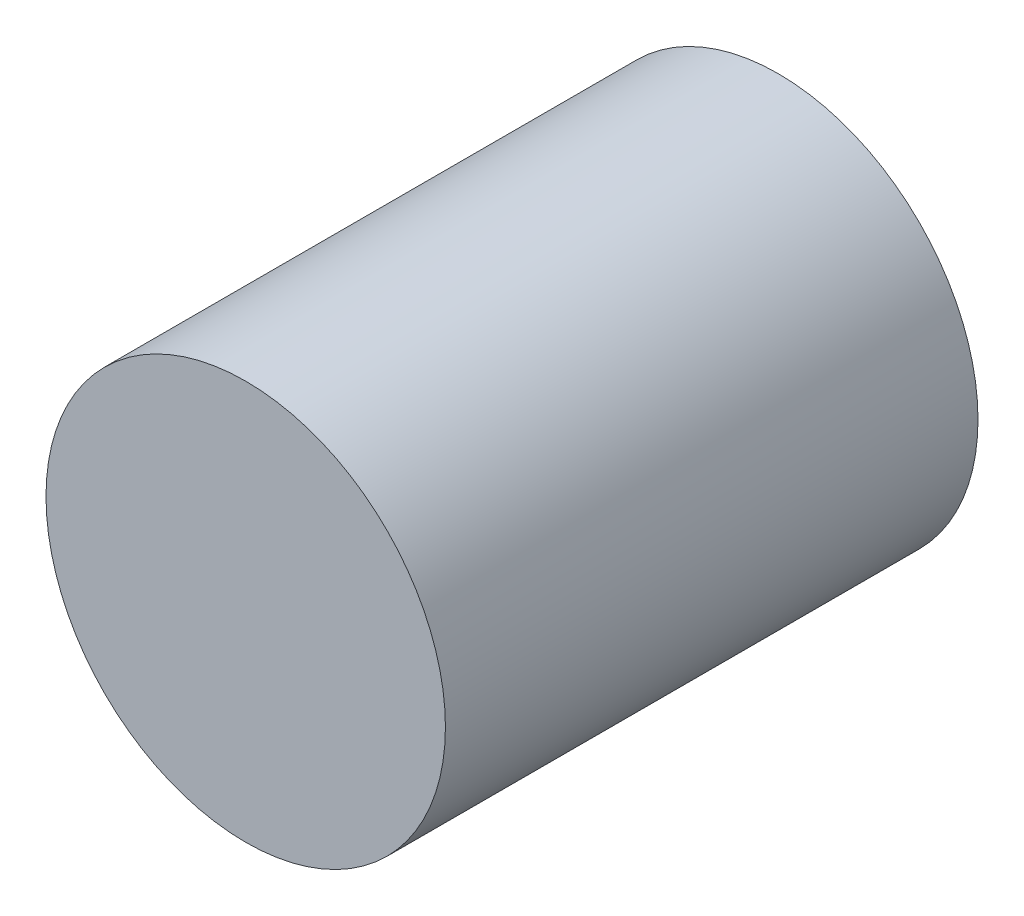
ISO-10303-21;
HEADER;
FILE_DESCRIPTION(('STEP AP214'),'2;1');
FILE_NAME('part.step','',(''),(''),'','','');
FILE_SCHEMA(('AUTOMOTIVE_DESIGN { 1 0 10303 214 1 1 1 1 }'));
ENDSEC;
DATA;
#1=APPLICATION_CONTEXT('core data for automotive mechanical design processes');
#2=APPLICATION_PROTOCOL_DEFINITION('international standard','automotive_design',2000,#1);
#3=PRODUCT_CONTEXT('',#1,'mechanical');
#4=PRODUCT('Part','Part','',(#3));
#5=PRODUCT_RELATED_PRODUCT_CATEGORY('part','',(#4));
#6=PRODUCT_DEFINITION_FORMATION('','',#4);
#7=PRODUCT_DEFINITION_CONTEXT('part definition',#1,'design');
#8=PRODUCT_DEFINITION('design','',#6,#7);
#9=PRODUCT_DEFINITION_SHAPE('','',#8);
#10=(LENGTH_UNIT() NAMED_UNIT(*) SI_UNIT(.MILLI.,.METRE.));
#11=(NAMED_UNIT(*) PLANE_ANGLE_UNIT() SI_UNIT($,.RADIAN.));
#12=(NAMED_UNIT(*) SI_UNIT($,.STERADIAN.) SOLID_ANGLE_UNIT());
#13=UNCERTAINTY_MEASURE_WITH_UNIT(LENGTH_MEASURE(1.E-05),#10,'distance_accuracy_value','');
#14=(GEOMETRIC_REPRESENTATION_CONTEXT(3) GLOBAL_UNCERTAINTY_ASSIGNED_CONTEXT((#13)) GLOBAL_UNIT_ASSIGNED_CONTEXT((#10,
#11,#12)) REPRESENTATION_CONTEXT('',''));
#15=CARTESIAN_POINT('',(0.,0.,0.));
#16=DIRECTION('',(0.,0.,1.));
#17=DIRECTION('',(1.,0.,0.));
#18=AXIS2_PLACEMENT_3D('',#15,#16,#17);
#19=CARTESIAN_POINT('',(0.,0.,60.));
#20=DIRECTION('',(0.,0.,-1.));
#21=DIRECTION('',(-1.,0.,0.));
#22=AXIS2_PLACEMENT_3D('',#19,#20,#21);
#23=CYLINDRICAL_SURFACE('',#22,45.);
#24=CARTESIAN_POINT('',(0.,0.,60.));
#25=DIRECTION('',(0.,0.,1.));
#26=DIRECTION('',(1.,0.,0.));
#27=AXIS2_PLACEMENT_3D('',#24,#25,#26);
#28=CIRCLE('',#27,45.);
#29=CARTESIAN_POINT('',(45.,0.,60.));
#30=VERTEX_POINT('',#29);
#31=EDGE_CURVE('E10',#30,#30,#28,.T.);
#32=ORIENTED_EDGE('',*,*,#31,.F.);
#33=EDGE_LOOP('',(#32));
#34=FACE_BOUND('',#33,.T.);
#35=CARTESIAN_POINT('',(0.,0.,-60.));
#36=DIRECTION('',(0.,0.,1.));
#37=DIRECTION('',(1.,0.,0.));
#38=AXIS2_PLACEMENT_3D('',#35,#36,#37);
#39=CIRCLE('',#38,45.);
#40=CARTESIAN_POINT('',(45.,0.,-60.));
#41=VERTEX_POINT('',#40);
#42=EDGE_CURVE('E40',#41,#41,#39,.T.);
#43=ORIENTED_EDGE('',*,*,#42,.T.);
#44=EDGE_LOOP('',(#43));
#45=FACE_BOUND('',#44,.T.);
#46=ADVANCED_FACE('F37',(#34,#45),#23,.T.);
#47=CARTESIAN_POINT('',(0.,0.,60.));
#48=DIRECTION('',(0.,0.,1.));
#49=DIRECTION('',(1.,0.,0.));
#50=AXIS2_PLACEMENT_3D('',#47,#48,#49);
#51=PLANE('',#50);
#52=ORIENTED_EDGE('',*,*,#31,.T.);
#53=EDGE_LOOP('',(#52));
#54=FACE_BOUND('',#53,.T.);
#55=ADVANCED_FACE('F52',(#54),#51,.T.);
#56=CARTESIAN_POINT('',(0.,0.,-60.));
#57=DIRECTION('',(0.,0.,1.));
#58=DIRECTION('',(1.,0.,0.));
#59=AXIS2_PLACEMENT_3D('',#56,#57,#58);
#60=PLANE('',#59);
#61=ORIENTED_EDGE('',*,*,#42,.F.);
#62=EDGE_LOOP('',(#61));
#63=FACE_BOUND('',#62,.T.);
#64=ADVANCED_FACE('F50',(#63),#60,.F.);
#65=CLOSED_SHELL('',(#46,#55,#64));
#66=MANIFOLD_SOLID_BREP('B2',#65);
#67=ADVANCED_BREP_SHAPE_REPRESENTATION('',(#18,#66),#14);
#68=SHAPE_DEFINITION_REPRESENTATION(#9,#67);
ENDSEC;
END-ISO-10303-21;
